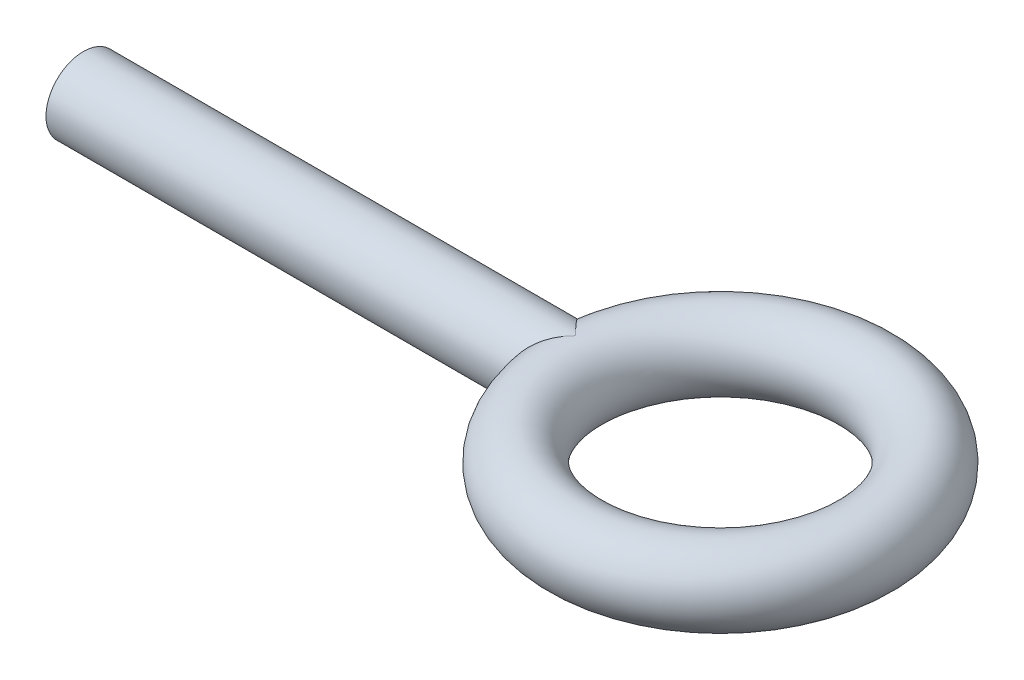
ISO-10303-21;
HEADER;
FILE_DESCRIPTION(('STEP AP214'),'2;1');
FILE_NAME('part.step','',(''),(''),'','','');
FILE_SCHEMA(('AUTOMOTIVE_DESIGN { 1 0 10303 214 1 1 1 1 }'));
ENDSEC;
DATA;
#1=APPLICATION_CONTEXT('core data for automotive mechanical design processes');
#2=APPLICATION_PROTOCOL_DEFINITION('international standard','automotive_design',2000,#1);
#3=PRODUCT_CONTEXT('',#1,'mechanical');
#4=PRODUCT('Part','Part','',(#3));
#5=PRODUCT_RELATED_PRODUCT_CATEGORY('part','',(#4));
#6=PRODUCT_DEFINITION_FORMATION('','',#4);
#7=PRODUCT_DEFINITION_CONTEXT('part definition',#1,'design');
#8=PRODUCT_DEFINITION('design','',#6,#7);
#9=PRODUCT_DEFINITION_SHAPE('','',#8);
#10=(LENGTH_UNIT() NAMED_UNIT(*) SI_UNIT(.MILLI.,.METRE.));
#11=(NAMED_UNIT(*) PLANE_ANGLE_UNIT() SI_UNIT($,.RADIAN.));
#12=(NAMED_UNIT(*) SI_UNIT($,.STERADIAN.) SOLID_ANGLE_UNIT());
#13=UNCERTAINTY_MEASURE_WITH_UNIT(LENGTH_MEASURE(1.E-05),#10,'distance_accuracy_value','');
#14=(GEOMETRIC_REPRESENTATION_CONTEXT(3) GLOBAL_UNCERTAINTY_ASSIGNED_CONTEXT((#13)) GLOBAL_UNIT_ASSIGNED_CONTEXT((#10,
#11,#12)) REPRESENTATION_CONTEXT('',''));
#15=CARTESIAN_POINT('',(0.,0.,0.));
#16=DIRECTION('',(0.,0.,1.));
#17=DIRECTION('',(1.,0.,0.));
#18=AXIS2_PLACEMENT_3D('',#15,#16,#17);
#19=CARTESIAN_POINT('',(-17.272,101.6,44.45));
#20=DIRECTION('',(1.,0.,0.));
#21=DIRECTION('',(0.,0.,-1.));
#22=AXIS2_PLACEMENT_3D('',#19,#20,#21);
#23=CYLINDRICAL_SURFACE('',#22,3.6195);
#24=CARTESIAN_POINT('',(-17.272,101.6,44.45));
#25=DIRECTION('',(-1.,0.,0.));
#26=DIRECTION('',(0.,0.,1.));
#27=AXIS2_PLACEMENT_3D('',#24,#25,#26);
#28=CIRCLE('',#27,3.6195);
#29=CARTESIAN_POINT('',(-17.272,101.6,48.0695));
#30=VERTEX_POINT('',#29);
#31=EDGE_CURVE('E11',#30,#30,#28,.T.);
#32=ORIENTED_EDGE('',*,*,#31,.F.);
#33=EDGE_LOOP('',(#32));
#34=FACE_BOUND('',#33,.T.);
#35=CARTESIAN_POINT('',(30.4165,97.9805,44.45));
#36=CARTESIAN_POINT('',(30.4136639657042,97.9805000045546,44.4471639705153));
#37=CARTESIAN_POINT('',(30.4108283168384,97.9805033376762,44.4443274618156));
#38=CARTESIAN_POINT('',(30.1925452456707,97.9810164961156,44.2259117094396));
#39=CARTESIAN_POINT('',(29.9793489583989,98.0007643533984,44.0075980732544));
#40=CARTESIAN_POINT('',(29.56083225793,98.0820826000475,43.5698083149328));
#41=CARTESIAN_POINT('',(29.3555348897954,98.1437668100501,43.3503306461379));
#42=CARTESIAN_POINT('',(29.0517359683541,98.2730038131233,43.0192703350207));
#43=CARTESIAN_POINT('',(28.9484599931753,98.32412095492,42.9055389117991));
#44=CARTESIAN_POINT('',(28.7463687466796,98.4398006606665,42.6808503641712));
#45=CARTESIAN_POINT('',(28.6475545500219,98.5043664430434,42.5698939109818));
#46=CARTESIAN_POINT('',(28.4557265054271,98.6472989853363,42.3525729258087));
#47=CARTESIAN_POINT('',(28.3626967502028,98.7256254035971,42.2461960728712));
#48=CARTESIAN_POINT('',(28.1834143878099,98.8965972653712,42.0395303051494));
#49=CARTESIAN_POINT('',(28.0971569991733,98.9892324668657,41.9392371067326));
#50=CARTESIAN_POINT('',(27.9144499901177,99.2114062725506,41.7252625464433));
#51=CARTESIAN_POINT('',(27.820009187661,99.3445688917352,41.6135744508969));
#52=CARTESIAN_POINT('',(27.6464791422638,99.6324112350545,41.4068656816528));
#53=CARTESIAN_POINT('',(27.5673834957462,99.7870819373454,41.3118380570947));
#54=CARTESIAN_POINT('',(27.4626987701624,100.034191131714,41.1853817300405));
#55=CARTESIAN_POINT('',(27.430002389883,100.11954356787,41.1457532944886));
#56=CARTESIAN_POINT('',(27.3699124690159,100.294656803715,41.0727467655902));
#57=CARTESIAN_POINT('',(27.3425162249525,100.384415326512,41.0393654860004));
#58=CARTESIAN_POINT('',(27.2934771314707,100.567675709335,40.9794989763127));
#59=CARTESIAN_POINT('',(27.2718313374138,100.661175625167,40.9530102168984));
#60=CARTESIAN_POINT('',(27.2346644610973,100.851156651669,40.907465746759));
#61=CARTESIAN_POINT('',(27.2191423487625,100.947637258005,40.8884087859245));
#62=CARTESIAN_POINT('',(27.1960977491408,101.130150975718,40.8600934806842));
#63=CARTESIAN_POINT('',(27.1878061477896,101.21594247932,40.8498937825678));
#64=CARTESIAN_POINT('',(27.176236267078,101.388366864034,40.8356572681483));
#65=CARTESIAN_POINT('',(27.1729574737953,101.474999657978,40.83161982008));
#66=CARTESIAN_POINT('',(27.1714679519017,101.648348922642,40.8297860095273));
#67=CARTESIAN_POINT('',(27.1732554395278,101.735065353169,40.8319874504216));
#68=CARTESIAN_POINT('',(27.181857540611,101.907843638585,40.8425746649877));
#69=CARTESIAN_POINT('',(27.1886719842679,101.993905515484,40.8509602297726));
#70=CARTESIAN_POINT('',(27.2149564974839,102.235644816394,40.8832743138976));
#71=CARTESIAN_POINT('',(27.2402360260182,102.389828201902,40.9143263797023));
#72=CARTESIAN_POINT('',(27.3060908659506,102.689701914785,40.994930630475));
#73=CARTESIAN_POINT('',(27.3466671200469,102.835391718084,41.0444839556266));
#74=CARTESIAN_POINT('',(27.4439512957694,103.123170768495,41.1627199183834));
#75=CARTESIAN_POINT('',(27.5014154301428,103.264635102998,41.2322950551238));
#76=CARTESIAN_POINT('',(27.6291647845119,103.53304532178,41.3860000311396));
#77=CARTESIAN_POINT('',(27.6994570539704,103.65998316058,41.4701378717596));
#78=CARTESIAN_POINT('',(27.8831466546802,103.949410171026,41.6883970039209));
#79=CARTESIAN_POINT('',(28.0021202422757,104.10387822971,41.8285032964981));
#80=CARTESIAN_POINT('',(28.2565655356556,104.380968648581,42.1244253248263));
#81=CARTESIAN_POINT('',(28.392072743661,104.503520644002,42.280274737447));
#82=CARTESIAN_POINT('',(28.7196366222051,104.751400793603,42.6517722548734));
#83=CARTESIAN_POINT('',(28.9161474425931,104.865669437682,42.8709085940269));
#84=CARTESIAN_POINT('',(29.221133872079,105.000424739067,43.2040961660802));
#85=CARTESIAN_POINT('',(29.3245352076192,105.039241986377,43.3159435332884));
#86=CARTESIAN_POINT('',(29.5342143869792,105.105286142738,43.5403710546668));
#87=CARTESIAN_POINT('',(29.6404923388337,105.132512615839,43.6529512362376));
#88=CARTESIAN_POINT('',(29.9639768832244,105.197772414054,43.9918378567247));
#89=CARTESIAN_POINT('',(30.184849818087,105.218965062186,44.2182114008612));
#90=CARTESIAN_POINT('',(30.4108283405131,105.219496666835,44.4443274880888));
#91=CARTESIAN_POINT('',(30.4136639896611,105.21950000001,44.4471639971032));
#92=CARTESIAN_POINT('',(30.4165,105.2195,44.45));
#93=B_SPLINE_CURVE_WITH_KNOTS('',3,(#35,#36,#37,#38,#39,#40,#41,#42,#43,#44,#45,#46,#47,#48,#49,
#50,#51,#52,#53,#54,#55,#56,#57,#58,#59,#60,#61,#62,#63,#64,#65,#66,#67,#68,#69,#70,#71,#72,#73,
#74,#75,#76,#77,#78,#79,#80,#81,#82,#83,#84,#85,#86,#87,#88,#89,#90,#91,#92),.UNSPECIFIED.,.F.,
.F.,(4,2,2,2,2,2,2,2,2,2,2,2,2,2,2,2,2,2,2,2,2,2,2,2,2,2,2,2,4),(0.,0.0120324604044605,
0.926364209798726,1.84318753242382,2.3283667879731,2.8136622866296,3.29755810360102,
3.78110914646534,4.37235844536477,4.96336048102838,5.26186325911369,5.56021337411975,
5.85841041691707,6.15655727807001,6.41658010125536,6.67657626463038,6.93648089854867,
7.19637675382813,7.67193973315604,8.14753202500634,8.64894499846677,9.15063434836345,
9.86693760353715,10.5848069603978,11.5266122990001,11.9978262016768,12.4690578259748,
13.4160400352366,13.4280724956411),.UNSPECIFIED.);
#94=CARTESIAN_POINT('',(30.4165,97.9805,44.45));
#95=VERTEX_POINT('',#94);
#96=CARTESIAN_POINT('',(30.4165,105.2195,44.45));
#97=VERTEX_POINT('',#96);
#98=EDGE_CURVE('E49',#95,#97,#93,.T.);
#99=ORIENTED_EDGE('',*,*,#98,.F.);
#100=CARTESIAN_POINT('',(30.4165,105.2195,44.45));
#101=CARTESIAN_POINT('',(30.4136639690251,105.219499996794,44.4528360257));
#102=CARTESIAN_POINT('',(30.4108283201165,105.219496663655,44.4556725344486));
#103=CARTESIAN_POINT('',(30.1924418438298,105.218983160174,44.6741917899304));
#104=CARTESIAN_POINT('',(29.9791256130995,105.199208936355,44.892632855305));
#105=CARTESIAN_POINT('',(29.5606547135684,105.117866159982,45.330380114377));
#106=CARTESIAN_POINT('',(29.3555151302417,105.056223828139,45.5496871546987));
#107=CARTESIAN_POINT('',(28.9799015498744,104.896438454244,45.9590134680353));
#108=CARTESIAN_POINT('',(28.8080875891813,104.803012910906,46.1496170885752));
#109=CARTESIAN_POINT('',(28.479211302052,104.577015096951,46.5200480328817));
#110=CARTESIAN_POINT('',(28.3221269549756,104.444502531675,46.6998912927483));
#111=CARTESIAN_POINT('',(28.0603253657686,104.171495760345,47.0034977883347));
#112=CARTESIAN_POINT('',(27.9516376895664,104.038958025334,47.130966918851));
#113=CARTESIAN_POINT('',(27.750535446273,103.748563298807,47.3688339053152));
#114=CARTESIAN_POINT('',(27.6581024122938,103.590735434296,47.4792511163282));
#115=CARTESIAN_POINT('',(27.5077750174419,103.280224990303,47.6600041312475));
#116=CARTESIAN_POINT('',(27.4466798355843,103.131237741547,47.7339631738959));
#117=CARTESIAN_POINT('',(27.3676563671836,102.89748279534,47.8300067748855));
#118=CARTESIAN_POINT('',(27.3434123150263,102.817823212926,47.8595463455509));
#119=CARTESIAN_POINT('',(27.2994286514223,102.655513386324,47.9132305107165));
#120=CARTESIAN_POINT('',(27.279687149149,102.572864414473,47.9373773697739));
#121=CARTESIAN_POINT('',(27.2448764718625,102.404596454901,47.9800120417664));
#122=CARTESIAN_POINT('',(27.2298364821699,102.318962445607,47.9984644971579));
#123=CARTESIAN_POINT('',(27.2048270740344,102.145898511944,48.0291752075165));
#124=CARTESIAN_POINT('',(27.1948553691436,102.058469415943,48.0414362555878));
#125=CARTESIAN_POINT('',(27.180137469226,101.882512655188,48.059540523386));
#126=CARTESIAN_POINT('',(27.1753908015643,101.79398509053,48.0653843235899));
#127=CARTESIAN_POINT('',(27.1711944832839,101.616643953497,48.0705507509685));
#128=CARTESIAN_POINT('',(27.1717443959988,101.527830405303,48.0698739157244));
#129=CARTESIAN_POINT('',(27.1807407077046,101.279150102528,48.058797876973));
#130=CARTESIAN_POINT('',(27.1951964208988,101.119731414554,48.0409996917243));
#131=CARTESIAN_POINT('',(27.2406767692855,100.807065803437,47.9851546482093));
#132=CARTESIAN_POINT('',(27.2717014119932,100.653818883092,47.9471077807587));
#133=CARTESIAN_POINT('',(27.3492764585324,100.355191984025,47.8523625789831));
#134=CARTESIAN_POINT('',(27.3960144684558,100.209933005578,47.7954389881546));
#135=CARTESIAN_POINT('',(27.5029417115559,99.9319819520642,47.6659051498804));
#136=CARTESIAN_POINT('',(27.5631350731181,99.7992937518066,47.5932900881887));
#137=CARTESIAN_POINT('',(27.7034320532823,99.5317979194239,47.4251274587957));
#138=CARTESIAN_POINT('',(27.7851014890726,99.3989181652816,47.3278308752834));
#139=CARTESIAN_POINT('',(27.9602593316253,99.1519443690745,47.1209205066299));
#140=CARTESIAN_POINT('',(28.053756059769,99.0378636849653,47.0112980554175));
#141=CARTESIAN_POINT('',(28.3012162093474,98.7741627249973,46.7239147342801));
#142=CARTESIAN_POINT('',(28.4614135042382,98.6367445651677,46.540273069232));
#143=CARTESIAN_POINT('',(28.7974745952437,98.4028694636568,46.1614063522182));
#144=CARTESIAN_POINT('',(28.9733740399271,98.3065087503501,45.9661552969209));
#145=CARTESIAN_POINT('',(29.3536759530397,98.1443736618243,45.5516605601482));
#146=CARTESIAN_POINT('',(29.55918561291,98.0824950039596,45.3319329962398));
#147=CARTESIAN_POINT('',(29.9783920075819,98.0008586326366,44.8933842563879));
#148=CARTESIAN_POINT('',(30.1920717139709,97.9810177049617,44.6745621471668));
#149=CARTESIAN_POINT('',(30.410828320295,97.9805033364125,44.4556725342392));
#150=CARTESIAN_POINT('',(30.4136639692049,97.9805000032745,44.4528360254889));
#151=CARTESIAN_POINT('',(30.4165,97.9805,44.45));
#152=B_SPLINE_CURVE_WITH_KNOTS('',3,(#100,#101,#102,#103,#104,#105,#106,#107,#108,#109,#110,
#111,#112,#113,#114,#115,#116,#117,#118,#119,#120,#121,#122,#123,#124,#125,#126,#127,#128,#129,
#130,#131,#132,#133,#134,#135,#136,#137,#138,#139,#140,#141,#142,#143,#144,#145,#146,#147,#148,
#149,#150,#151),.UNSPECIFIED.,.F.,.F.,(4,2,2,2,2,2,2,2,2,2,2,2,2,2,2,2,2,2,2,2,2,2,2,2,2,4),(0.,
0.0120324604044606,0.926801975837405,1.8431876796237,2.65956719016244,3.4747060841037,
4.11315196714473,4.75086775915375,5.28005621288025,5.54483109951053,5.80949458948738,
6.07576980861961,6.3419247965473,6.60805570723335,6.87416467746007,7.35483299790616,
7.83550153637056,8.32212570686455,8.80889938935057,9.35836402377518,9.90821742037261,
10.7429017891891,11.5795318294404,12.4976912798977,13.4140315175134,13.4260639779179),.UNSPECIFIED.);
#153=EDGE_CURVE('E42',#97,#95,#152,.T.);
#154=ORIENTED_EDGE('',*,*,#153,.F.);
#155=EDGE_LOOP('',(#99,#154));
#156=FACE_BOUND('',#155,.T.);
#157=ADVANCED_FACE('F34',(#34,#156),#23,.T.);
#158=CARTESIAN_POINT('',(-17.272,101.6,44.45));
#159=DIRECTION('',(-1.,0.,0.));
#160=DIRECTION('',(0.,0.,1.));
#161=AXIS2_PLACEMENT_3D('',#158,#159,#160);
#162=PLANE('',#161);
#163=ORIENTED_EDGE('',*,*,#31,.T.);
#164=EDGE_LOOP('',(#163));
#165=FACE_BOUND('',#164,.T.);
#166=ADVANCED_FACE('F66',(#165),#162,.T.);
#167=CARTESIAN_POINT('',(44.45,101.6,44.45));
#168=DIRECTION('',(0.,1.,0.));
#169=DIRECTION('',(0.,0.,1.));
#170=AXIS2_PLACEMENT_3D('',#167,#168,#169);
#171=TOROIDAL_SURFACE('',#170,14.0335,3.61949999999999);
#172=ORIENTED_EDGE('',*,*,#98,.T.);
#173=ORIENTED_EDGE('',*,*,#153,.T.);
#174=EDGE_LOOP('',(#172,#173));
#175=FACE_BOUND('',#174,.T.);
#176=ADVANCED_FACE('F36',(#175),#171,.T.);
#177=CLOSED_SHELL('',(#157,#166,#176));
#178=MANIFOLD_SOLID_BREP('B2',#177);
#179=ADVANCED_BREP_SHAPE_REPRESENTATION('',(#18,#178),#14);
#180=SHAPE_DEFINITION_REPRESENTATION(#9,#179);
ENDSEC;
END-ISO-10303-21;
